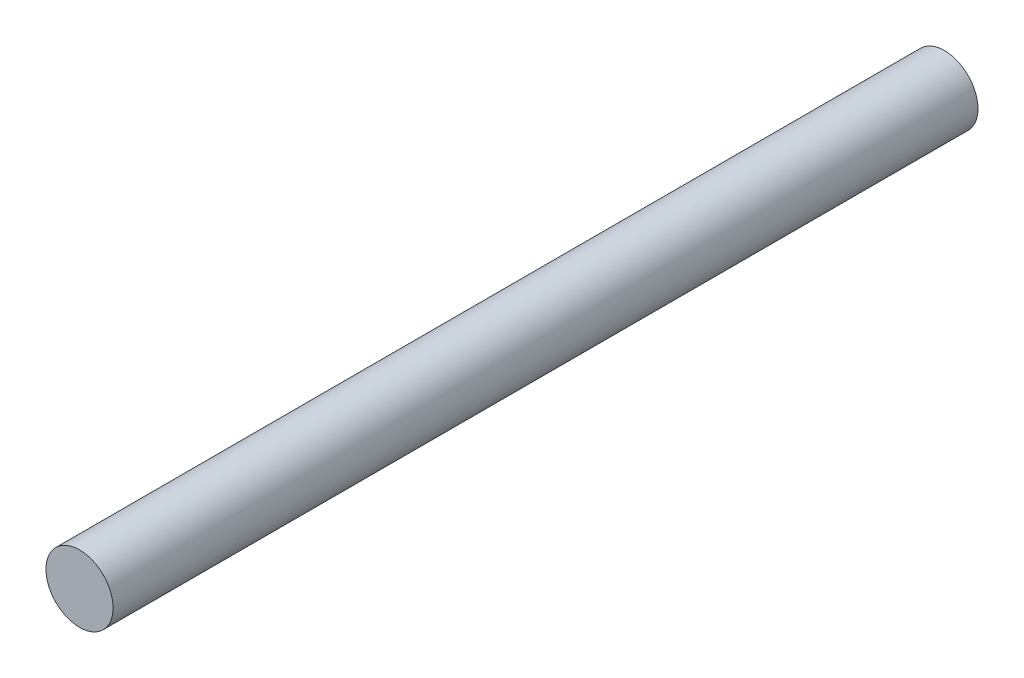
ISO-10303-21;
HEADER;
FILE_DESCRIPTION(('STEP AP214'),'2;1');
FILE_NAME('part.step','',(''),(''),'','','');
FILE_SCHEMA(('AUTOMOTIVE_DESIGN { 1 0 10303 214 1 1 1 1 }'));
ENDSEC;
DATA;
#1=APPLICATION_CONTEXT('core data for automotive mechanical design processes');
#2=APPLICATION_PROTOCOL_DEFINITION('international standard','automotive_design',2000,#1);
#3=PRODUCT_CONTEXT('',#1,'mechanical');
#4=PRODUCT('Part','Part','',(#3));
#5=PRODUCT_RELATED_PRODUCT_CATEGORY('part','',(#4));
#6=PRODUCT_DEFINITION_FORMATION('','',#4);
#7=PRODUCT_DEFINITION_CONTEXT('part definition',#1,'design');
#8=PRODUCT_DEFINITION('design','',#6,#7);
#9=PRODUCT_DEFINITION_SHAPE('','',#8);
#10=(LENGTH_UNIT() NAMED_UNIT(*) SI_UNIT(.MILLI.,.METRE.));
#11=(NAMED_UNIT(*) PLANE_ANGLE_UNIT() SI_UNIT($,.RADIAN.));
#12=(NAMED_UNIT(*) SI_UNIT($,.STERADIAN.) SOLID_ANGLE_UNIT());
#13=UNCERTAINTY_MEASURE_WITH_UNIT(LENGTH_MEASURE(1.E-05),#10,'distance_accuracy_value','');
#14=(GEOMETRIC_REPRESENTATION_CONTEXT(3) GLOBAL_UNCERTAINTY_ASSIGNED_CONTEXT((#13)) GLOBAL_UNIT_ASSIGNED_CONTEXT((#10,
#11,#12)) REPRESENTATION_CONTEXT('',''));
#15=CARTESIAN_POINT('',(0.,0.,0.));
#16=DIRECTION('',(0.,0.,1.));
#17=DIRECTION('',(1.,0.,0.));
#18=AXIS2_PLACEMENT_3D('',#15,#16,#17);
#19=CARTESIAN_POINT('',(0.,0.,103.));
#20=DIRECTION('',(0.,0.,-1.));
#21=DIRECTION('',(-1.,0.,0.));
#22=AXIS2_PLACEMENT_3D('',#19,#20,#21);
#23=CYLINDRICAL_SURFACE('',#22,4.);
#24=CARTESIAN_POINT('',(0.,0.,103.));
#25=DIRECTION('',(0.,0.,1.));
#26=DIRECTION('',(1.,0.,0.));
#27=AXIS2_PLACEMENT_3D('',#24,#25,#26);
#28=CIRCLE('',#27,4.);
#29=CARTESIAN_POINT('',(4.,0.,103.));
#30=VERTEX_POINT('',#29);
#31=EDGE_CURVE('E10',#30,#30,#28,.T.);
#32=ORIENTED_EDGE('',*,*,#31,.F.);
#33=EDGE_LOOP('',(#32));
#34=FACE_BOUND('',#33,.T.);
#35=CARTESIAN_POINT('',(0.,0.,0.));
#36=DIRECTION('',(0.,0.,1.));
#37=DIRECTION('',(1.,0.,0.));
#38=AXIS2_PLACEMENT_3D('',#35,#36,#37);
#39=CIRCLE('',#38,4.);
#40=CARTESIAN_POINT('',(4.,0.,0.));
#41=VERTEX_POINT('',#40);
#42=EDGE_CURVE('E34',#41,#41,#39,.T.);
#43=ORIENTED_EDGE('',*,*,#42,.T.);
#44=EDGE_LOOP('',(#43));
#45=FACE_BOUND('',#44,.T.);
#46=ADVANCED_FACE('F31',(#34,#45),#23,.T.);
#47=CARTESIAN_POINT('',(0.,0.,103.));
#48=DIRECTION('',(0.,0.,1.));
#49=DIRECTION('',(1.,0.,0.));
#50=AXIS2_PLACEMENT_3D('',#47,#48,#49);
#51=PLANE('',#50);
#52=ORIENTED_EDGE('',*,*,#31,.T.);
#53=EDGE_LOOP('',(#52));
#54=FACE_BOUND('',#53,.T.);
#55=ADVANCED_FACE('F46',(#54),#51,.T.);
#56=CARTESIAN_POINT('',(0.,0.,0.));
#57=DIRECTION('',(0.,0.,1.));
#58=DIRECTION('',(1.,0.,0.));
#59=AXIS2_PLACEMENT_3D('',#56,#57,#58);
#60=PLANE('',#59);
#61=ORIENTED_EDGE('',*,*,#42,.F.);
#62=EDGE_LOOP('',(#61));
#63=FACE_BOUND('',#62,.T.);
#64=ADVANCED_FACE('F44',(#63),#60,.F.);
#65=CLOSED_SHELL('',(#46,#55,#64));
#66=MANIFOLD_SOLID_BREP('B2',#65);
#67=ADVANCED_BREP_SHAPE_REPRESENTATION('',(#18,#66),#14);
#68=SHAPE_DEFINITION_REPRESENTATION(#9,#67);
ENDSEC;
END-ISO-10303-21;
